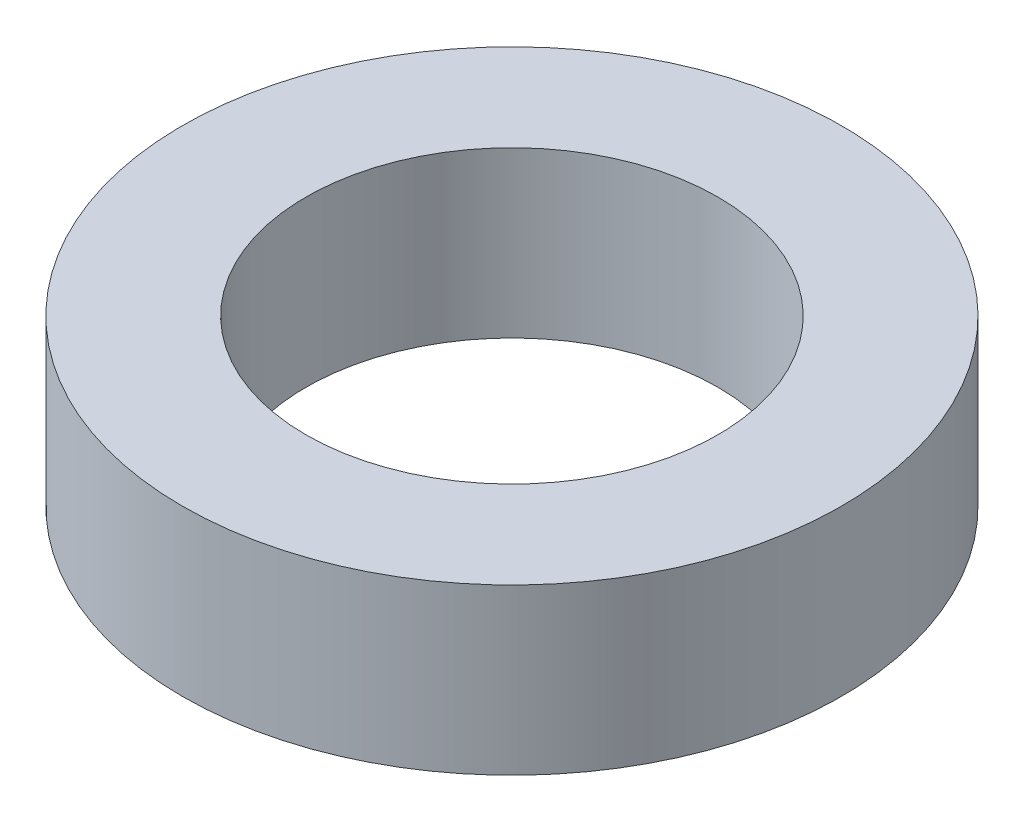
ISO-10303-21;
HEADER;
FILE_DESCRIPTION(('STEP AP214'),'2;1');
FILE_NAME('part.step','',(''),(''),'','','');
FILE_SCHEMA(('AUTOMOTIVE_DESIGN { 1 0 10303 214 1 1 1 1 }'));
ENDSEC;
DATA;
#1=APPLICATION_CONTEXT('core data for automotive mechanical design processes');
#2=APPLICATION_PROTOCOL_DEFINITION('international standard','automotive_design',2000,#1);
#3=PRODUCT_CONTEXT('',#1,'mechanical');
#4=PRODUCT('Part','Part','',(#3));
#5=PRODUCT_RELATED_PRODUCT_CATEGORY('part','',(#4));
#6=PRODUCT_DEFINITION_FORMATION('','',#4);
#7=PRODUCT_DEFINITION_CONTEXT('part definition',#1,'design');
#8=PRODUCT_DEFINITION('design','',#6,#7);
#9=PRODUCT_DEFINITION_SHAPE('','',#8);
#10=(LENGTH_UNIT() NAMED_UNIT(*) SI_UNIT(.MILLI.,.METRE.));
#11=(NAMED_UNIT(*) PLANE_ANGLE_UNIT() SI_UNIT($,.RADIAN.));
#12=(NAMED_UNIT(*) SI_UNIT($,.STERADIAN.) SOLID_ANGLE_UNIT());
#13=UNCERTAINTY_MEASURE_WITH_UNIT(LENGTH_MEASURE(1.E-05),#10,'distance_accuracy_value','');
#14=(GEOMETRIC_REPRESENTATION_CONTEXT(3) GLOBAL_UNCERTAINTY_ASSIGNED_CONTEXT((#13)) GLOBAL_UNIT_ASSIGNED_CONTEXT((#10,
#11,#12)) REPRESENTATION_CONTEXT('',''));
#15=CARTESIAN_POINT('',(0.,0.,0.));
#16=DIRECTION('',(0.,0.,1.));
#17=DIRECTION('',(1.,0.,0.));
#18=AXIS2_PLACEMENT_3D('',#15,#16,#17);
#19=CARTESIAN_POINT('',(0.,3.175,0.));
#20=DIRECTION('',(0.,1.,0.));
#21=DIRECTION('',(0.,0.,1.));
#22=AXIS2_PLACEMENT_3D('',#19,#20,#21);
#23=PLANE('',#22);
#24=CARTESIAN_POINT('',(0.,3.175,0.));
#25=DIRECTION('',(0.,1.,0.));
#26=DIRECTION('',(0.,0.,1.));
#27=AXIS2_PLACEMENT_3D('',#24,#25,#26);
#28=CIRCLE('',#27,6.35);
#29=CARTESIAN_POINT('',(0.,3.175,6.35));
#30=VERTEX_POINT('',#29);
#31=EDGE_CURVE('E10',#30,#30,#28,.T.);
#32=ORIENTED_EDGE('',*,*,#31,.T.);
#33=EDGE_LOOP('',(#32));
#34=FACE_BOUND('',#33,.T.);
#35=CARTESIAN_POINT('',(0.,3.175,0.));
#36=DIRECTION('',(0.,1.,0.));
#37=DIRECTION('',(0.,0.,1.));
#38=AXIS2_PLACEMENT_3D('',#35,#36,#37);
#39=CIRCLE('',#38,3.96875);
#40=CARTESIAN_POINT('',(0.,3.175,3.96875));
#41=VERTEX_POINT('',#40);
#42=EDGE_CURVE('E48',#41,#41,#39,.T.);
#43=ORIENTED_EDGE('',*,*,#42,.F.);
#44=EDGE_LOOP('',(#43));
#45=FACE_BOUND('',#44,.T.);
#46=ADVANCED_FACE('F40',(#34,#45),#23,.T.);
#47=CARTESIAN_POINT('',(0.,0.,0.));
#48=DIRECTION('',(0.,1.,0.));
#49=DIRECTION('',(0.,0.,1.));
#50=AXIS2_PLACEMENT_3D('',#47,#48,#49);
#51=PLANE('',#50);
#52=CARTESIAN_POINT('',(0.,0.,0.));
#53=DIRECTION('',(0.,1.,0.));
#54=DIRECTION('',(0.,0.,1.));
#55=AXIS2_PLACEMENT_3D('',#52,#53,#54);
#56=CIRCLE('',#55,6.35);
#57=CARTESIAN_POINT('',(0.,0.,6.35));
#58=VERTEX_POINT('',#57);
#59=EDGE_CURVE('E41',#58,#58,#56,.T.);
#60=ORIENTED_EDGE('',*,*,#59,.F.);
#61=EDGE_LOOP('',(#60));
#62=FACE_BOUND('',#61,.T.);
#63=CARTESIAN_POINT('',(0.,0.,0.));
#64=DIRECTION('',(0.,1.,0.));
#65=DIRECTION('',(0.,0.,1.));
#66=AXIS2_PLACEMENT_3D('',#63,#64,#65);
#67=CIRCLE('',#66,3.96875);
#68=CARTESIAN_POINT('',(0.,0.,3.96875));
#69=VERTEX_POINT('',#68);
#70=EDGE_CURVE('E49',#69,#69,#67,.T.);
#71=ORIENTED_EDGE('',*,*,#70,.T.);
#72=EDGE_LOOP('',(#71));
#73=FACE_BOUND('',#72,.T.);
#74=ADVANCED_FACE('F58',(#62,#73),#51,.F.);
#75=CARTESIAN_POINT('',(0.,3.175,0.));
#76=DIRECTION('',(0.,-1.,0.));
#77=DIRECTION('',(0.,0.,-1.));
#78=AXIS2_PLACEMENT_3D('',#75,#76,#77);
#79=CYLINDRICAL_SURFACE('',#78,6.35);
#80=ORIENTED_EDGE('',*,*,#31,.F.);
#81=EDGE_LOOP('',(#80));
#82=FACE_BOUND('',#81,.T.);
#83=ORIENTED_EDGE('',*,*,#59,.T.);
#84=EDGE_LOOP('',(#83));
#85=FACE_BOUND('',#84,.T.);
#86=ADVANCED_FACE('F39',(#82,#85),#79,.T.);
#87=CARTESIAN_POINT('',(0.,3.175,0.));
#88=DIRECTION('',(0.,-1.,0.));
#89=DIRECTION('',(0.,0.,-1.));
#90=AXIS2_PLACEMENT_3D('',#87,#88,#89);
#91=CYLINDRICAL_SURFACE('',#90,3.96875);
#92=ORIENTED_EDGE('',*,*,#42,.T.);
#93=EDGE_LOOP('',(#92));
#94=FACE_BOUND('',#93,.T.);
#95=ORIENTED_EDGE('',*,*,#70,.F.);
#96=EDGE_LOOP('',(#95));
#97=FACE_BOUND('',#96,.T.);
#98=ADVANCED_FACE('F57',(#94,#97),#91,.F.);
#99=CLOSED_SHELL('',(#46,#74,#86,#98));
#100=MANIFOLD_SOLID_BREP('B2',#99);
#101=ADVANCED_BREP_SHAPE_REPRESENTATION('',(#18,#100),#14);
#102=SHAPE_DEFINITION_REPRESENTATION(#9,#101);
ENDSEC;
END-ISO-10303-21;
